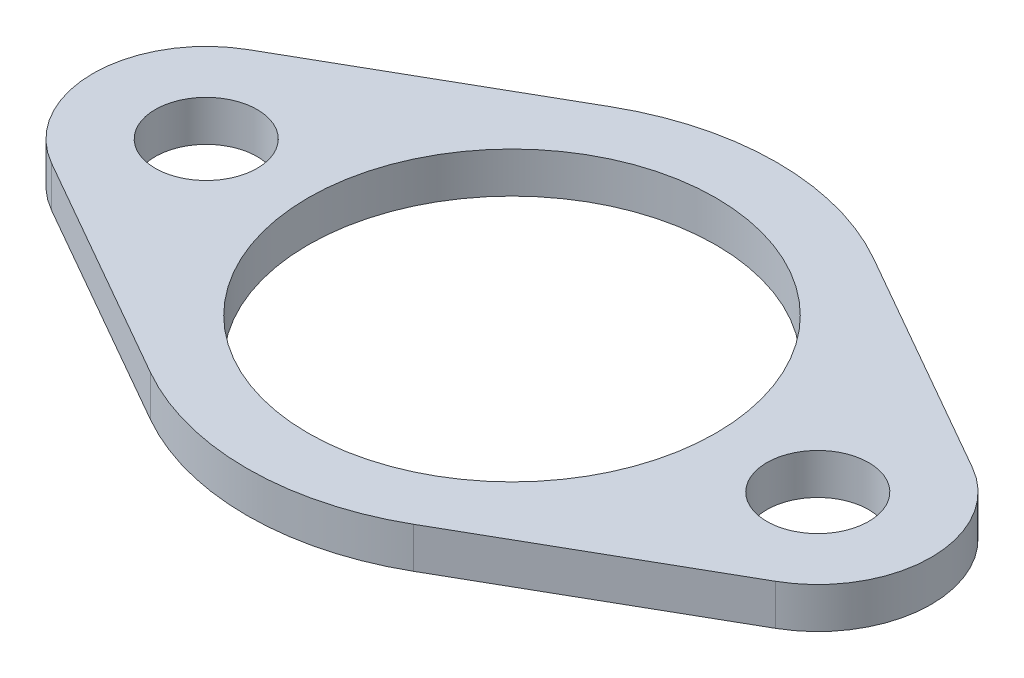
ISO-10303-21;
HEADER;
FILE_DESCRIPTION(('STEP AP214'),'2;1');
FILE_NAME('part.step','',(''),(''),'','','');
FILE_SCHEMA(('AUTOMOTIVE_DESIGN { 1 0 10303 214 1 1 1 1 }'));
ENDSEC;
DATA;
#1=APPLICATION_CONTEXT('core data for automotive mechanical design processes');
#2=APPLICATION_PROTOCOL_DEFINITION('international standard','automotive_design',2000,#1);
#3=PRODUCT_CONTEXT('',#1,'mechanical');
#4=PRODUCT('Part','Part','',(#3));
#5=PRODUCT_RELATED_PRODUCT_CATEGORY('part','',(#4));
#6=PRODUCT_DEFINITION_FORMATION('','',#4);
#7=PRODUCT_DEFINITION_CONTEXT('part definition',#1,'design');
#8=PRODUCT_DEFINITION('design','',#6,#7);
#9=PRODUCT_DEFINITION_SHAPE('','',#8);
#10=(LENGTH_UNIT() NAMED_UNIT(*) SI_UNIT(.MILLI.,.METRE.));
#11=(NAMED_UNIT(*) PLANE_ANGLE_UNIT() SI_UNIT($,.RADIAN.));
#12=(NAMED_UNIT(*) SI_UNIT($,.STERADIAN.) SOLID_ANGLE_UNIT());
#13=UNCERTAINTY_MEASURE_WITH_UNIT(LENGTH_MEASURE(1.E-05),#10,'distance_accuracy_value','');
#14=(GEOMETRIC_REPRESENTATION_CONTEXT(3) GLOBAL_UNCERTAINTY_ASSIGNED_CONTEXT((#13)) GLOBAL_UNIT_ASSIGNED_CONTEXT((#10,
#11,#12)) REPRESENTATION_CONTEXT('',''));
#15=CARTESIAN_POINT('',(0.,0.,0.));
#16=DIRECTION('',(0.,0.,1.));
#17=DIRECTION('',(1.,0.,0.));
#18=AXIS2_PLACEMENT_3D('',#15,#16,#17);
#19=CARTESIAN_POINT('',(-7.5,1.,0.));
#20=DIRECTION('',(0.,1.,0.));
#21=DIRECTION('',(0.,0.,1.));
#22=AXIS2_PLACEMENT_3D('',#19,#20,#21);
#23=PLANE('',#22);
#24=CARTESIAN_POINT('',(-7.5,1.,0.));
#25=DIRECTION('',(0.,1.,0.));
#26=DIRECTION('',(0.,0.,1.));
#27=AXIS2_PLACEMENT_3D('',#24,#25,#26);
#28=CIRCLE('',#27,1.25);
#29=CARTESIAN_POINT('',(-7.5,1.,1.25));
#30=VERTEX_POINT('',#29);
#31=EDGE_CURVE('E217',#30,#30,#28,.T.);
#32=ORIENTED_EDGE('',*,*,#31,.F.);
#33=EDGE_LOOP('',(#32));
#34=FACE_BOUND('',#33,.T.);
#35=CARTESIAN_POINT('',(-7.5,1.,0.));
#36=DIRECTION('',(0.,1.,0.));
#37=DIRECTION('',(0.,0.,1.));
#38=AXIS2_PLACEMENT_3D('',#35,#36,#37);
#39=CIRCLE('',#38,2.78);
#40=CARTESIAN_POINT('',(-8.87888,1.,-2.41393660761835));
#41=VERTEX_POINT('',#40);
#42=CARTESIAN_POINT('',(-8.87888,1.,2.41393660761835));
#43=VERTEX_POINT('',#42);
#44=EDGE_CURVE('E168',#41,#43,#39,.T.);
#45=ORIENTED_EDGE('',*,*,#44,.T.);
#46=DIRECTION('',(0.868322520726026,0.,0.496));
#47=VECTOR('',#46,1.);
#48=CARTESIAN_POINT('',(-8.87888,1.,2.41393660761835));
#49=LINE('',#48,#47);
#50=CARTESIAN_POINT('',(-3.224,1.,5.64409638471917));
#51=VERTEX_POINT('',#50);
#52=EDGE_CURVE('E104',#43,#51,#49,.T.);
#53=ORIENTED_EDGE('',*,*,#52,.T.);
#54=CARTESIAN_POINT('',(0.,1.,0.));
#55=DIRECTION('',(0.,1.,0.));
#56=DIRECTION('',(0.,0.,1.));
#57=AXIS2_PLACEMENT_3D('',#54,#55,#56);
#58=CIRCLE('',#57,6.5);
#59=CARTESIAN_POINT('',(3.224,1.,5.64409638471917));
#60=VERTEX_POINT('',#59);
#61=EDGE_CURVE('E189',#51,#60,#58,.T.);
#62=ORIENTED_EDGE('',*,*,#61,.T.);
#63=DIRECTION('',(0.868322520726026,0.,-0.496));
#64=VECTOR('',#63,1.);
#65=CARTESIAN_POINT('',(3.224,1.,5.64409638471917));
#66=LINE('',#65,#64);
#67=CARTESIAN_POINT('',(8.87888,1.,2.41393660761835));
#68=VERTEX_POINT('',#67);
#69=EDGE_CURVE('E203',#60,#68,#66,.T.);
#70=ORIENTED_EDGE('',*,*,#69,.T.);
#71=CARTESIAN_POINT('',(7.5,1.,0.));
#72=DIRECTION('',(0.,1.,0.));
#73=DIRECTION('',(0.,0.,-1.));
#74=AXIS2_PLACEMENT_3D('',#71,#72,#73);
#75=CIRCLE('',#74,2.78);
#76=CARTESIAN_POINT('',(8.87888,1.,-2.41393660761835));
#77=VERTEX_POINT('',#76);
#78=EDGE_CURVE('E123',#68,#77,#75,.T.);
#79=ORIENTED_EDGE('',*,*,#78,.T.);
#80=DIRECTION('',(-0.868322520726026,0.,-0.496));
#81=VECTOR('',#80,1.);
#82=CARTESIAN_POINT('',(3.224,1.,-5.64409638471917));
#83=LINE('',#82,#81);
#84=CARTESIAN_POINT('',(3.224,1.,-5.64409638471917));
#85=VERTEX_POINT('',#84);
#86=EDGE_CURVE('E117',#77,#85,#83,.T.);
#87=ORIENTED_EDGE('',*,*,#86,.T.);
#88=CARTESIAN_POINT('',(0.,1.,0.));
#89=DIRECTION('',(0.,1.,0.));
#90=DIRECTION('',(0.,0.,1.));
#91=AXIS2_PLACEMENT_3D('',#88,#89,#90);
#92=CIRCLE('',#91,6.5);
#93=CARTESIAN_POINT('',(-3.224,1.,-5.64409638471917));
#94=VERTEX_POINT('',#93);
#95=EDGE_CURVE('E121',#85,#94,#92,.T.);
#96=ORIENTED_EDGE('',*,*,#95,.T.);
#97=DIRECTION('',(-0.868322520726026,0.,0.496));
#98=VECTOR('',#97,1.);
#99=CARTESIAN_POINT('',(-8.87888,1.,-2.41393660761835));
#100=LINE('',#99,#98);
#101=EDGE_CURVE('E61',#94,#41,#100,.T.);
#102=ORIENTED_EDGE('',*,*,#101,.T.);
#103=EDGE_LOOP('',(#45,#53,#62,#70,#79,#87,#96,#102));
#104=FACE_BOUND('',#103,.T.);
#105=CARTESIAN_POINT('',(0.,1.,0.));
#106=DIRECTION('',(0.,1.,0.));
#107=DIRECTION('',(0.,0.,1.));
#108=AXIS2_PLACEMENT_3D('',#105,#106,#107);
#109=CIRCLE('',#108,5.);
#110=CARTESIAN_POINT('',(0.,1.,5.));
#111=VERTEX_POINT('',#110);
#112=EDGE_CURVE('E150',#111,#111,#109,.T.);
#113=ORIENTED_EDGE('',*,*,#112,.F.);
#114=EDGE_LOOP('',(#113));
#115=FACE_BOUND('',#114,.T.);
#116=CARTESIAN_POINT('',(7.5,1.,0.));
#117=DIRECTION('',(0.,1.,0.));
#118=DIRECTION('',(0.,0.,-1.));
#119=AXIS2_PLACEMENT_3D('',#116,#117,#118);
#120=CIRCLE('',#119,1.25);
#121=CARTESIAN_POINT('',(7.5,1.,-1.25));
#122=VERTEX_POINT('',#121);
#123=EDGE_CURVE('E225',#122,#122,#120,.T.);
#124=ORIENTED_EDGE('',*,*,#123,.F.);
#125=EDGE_LOOP('',(#124));
#126=FACE_BOUND('',#125,.T.);
#127=ADVANCED_FACE('F43',(#34,#104,#115,#126),#23,.T.);
#128=CARTESIAN_POINT('',(-7.5,0.,0.));
#129=DIRECTION('',(0.,1.,0.));
#130=DIRECTION('',(0.,0.,1.));
#131=AXIS2_PLACEMENT_3D('',#128,#129,#130);
#132=PLANE('',#131);
#133=CARTESIAN_POINT('',(-7.5,0.,0.));
#134=DIRECTION('',(0.,1.,0.));
#135=DIRECTION('',(0.,0.,1.));
#136=AXIS2_PLACEMENT_3D('',#133,#134,#135);
#137=CIRCLE('',#136,2.78);
#138=CARTESIAN_POINT('',(-8.87888,0.,-2.41393660761835));
#139=VERTEX_POINT('',#138);
#140=CARTESIAN_POINT('',(-8.87888,0.,2.41393660761835));
#141=VERTEX_POINT('',#140);
#142=EDGE_CURVE('E145',#139,#141,#137,.T.);
#143=ORIENTED_EDGE('',*,*,#142,.F.);
#144=DIRECTION('',(-0.868322520726026,0.,0.496));
#145=VECTOR('',#144,1.);
#146=CARTESIAN_POINT('',(-8.87888,0.,-2.41393660761835));
#147=LINE('',#146,#145);
#148=CARTESIAN_POINT('',(-3.224,0.,-5.64409638471917));
#149=VERTEX_POINT('',#148);
#150=EDGE_CURVE('E96',#149,#139,#147,.T.);
#151=ORIENTED_EDGE('',*,*,#150,.F.);
#152=CARTESIAN_POINT('',(0.,0.,0.));
#153=DIRECTION('',(0.,1.,0.));
#154=DIRECTION('',(0.,0.,1.));
#155=AXIS2_PLACEMENT_3D('',#152,#153,#154);
#156=CIRCLE('',#155,6.5);
#157=CARTESIAN_POINT('',(3.224,0.,-5.64409638471917));
#158=VERTEX_POINT('',#157);
#159=EDGE_CURVE('E90',#158,#149,#156,.T.);
#160=ORIENTED_EDGE('',*,*,#159,.F.);
#161=DIRECTION('',(-0.868322520726026,0.,-0.496));
#162=VECTOR('',#161,1.);
#163=CARTESIAN_POINT('',(3.224,0.,-5.64409638471917));
#164=LINE('',#163,#162);
#165=CARTESIAN_POINT('',(8.87888,0.,-2.41393660761835));
#166=VERTEX_POINT('',#165);
#167=EDGE_CURVE('E132',#166,#158,#164,.T.);
#168=ORIENTED_EDGE('',*,*,#167,.F.);
#169=CARTESIAN_POINT('',(7.5,0.,0.));
#170=DIRECTION('',(0.,1.,0.));
#171=DIRECTION('',(0.,0.,-1.));
#172=AXIS2_PLACEMENT_3D('',#169,#170,#171);
#173=CIRCLE('',#172,2.78);
#174=CARTESIAN_POINT('',(8.87888,0.,2.41393660761835));
#175=VERTEX_POINT('',#174);
#176=EDGE_CURVE('E159',#175,#166,#173,.T.);
#177=ORIENTED_EDGE('',*,*,#176,.F.);
#178=DIRECTION('',(0.868322520726026,0.,-0.496));
#179=VECTOR('',#178,1.);
#180=CARTESIAN_POINT('',(3.224,0.,5.64409638471917));
#181=LINE('',#180,#179);
#182=CARTESIAN_POINT('',(3.224,0.,5.64409638471917));
#183=VERTEX_POINT('',#182);
#184=EDGE_CURVE('E156',#183,#175,#181,.T.);
#185=ORIENTED_EDGE('',*,*,#184,.F.);
#186=CARTESIAN_POINT('',(0.,0.,0.));
#187=DIRECTION('',(0.,1.,0.));
#188=DIRECTION('',(0.,0.,1.));
#189=AXIS2_PLACEMENT_3D('',#186,#187,#188);
#190=CIRCLE('',#189,6.5);
#191=CARTESIAN_POINT('',(-3.224,0.,5.64409638471917));
#192=VERTEX_POINT('',#191);
#193=EDGE_CURVE('E153',#192,#183,#190,.T.);
#194=ORIENTED_EDGE('',*,*,#193,.F.);
#195=DIRECTION('',(0.868322520726026,0.,0.496));
#196=VECTOR('',#195,1.);
#197=CARTESIAN_POINT('',(-8.87888,0.,2.41393660761835));
#198=LINE('',#197,#196);
#199=EDGE_CURVE('E149',#141,#192,#198,.T.);
#200=ORIENTED_EDGE('',*,*,#199,.F.);
#201=EDGE_LOOP('',(#143,#151,#160,#168,#177,#185,#194,#200));
#202=FACE_BOUND('',#201,.T.);
#203=CARTESIAN_POINT('',(0.,0.,0.));
#204=DIRECTION('',(0.,1.,0.));
#205=DIRECTION('',(0.,0.,1.));
#206=AXIS2_PLACEMENT_3D('',#203,#204,#205);
#207=CIRCLE('',#206,5.);
#208=CARTESIAN_POINT('',(0.,0.,5.));
#209=VERTEX_POINT('',#208);
#210=EDGE_CURVE('E213',#209,#209,#207,.T.);
#211=ORIENTED_EDGE('',*,*,#210,.T.);
#212=EDGE_LOOP('',(#211));
#213=FACE_BOUND('',#212,.T.);
#214=CARTESIAN_POINT('',(-7.5,0.,0.));
#215=DIRECTION('',(0.,1.,0.));
#216=DIRECTION('',(0.,0.,1.));
#217=AXIS2_PLACEMENT_3D('',#214,#215,#216);
#218=CIRCLE('',#217,1.25);
#219=CARTESIAN_POINT('',(-7.5,0.,1.25));
#220=VERTEX_POINT('',#219);
#221=EDGE_CURVE('E221',#220,#220,#218,.T.);
#222=ORIENTED_EDGE('',*,*,#221,.T.);
#223=EDGE_LOOP('',(#222));
#224=FACE_BOUND('',#223,.T.);
#225=CARTESIAN_POINT('',(7.5,0.,0.));
#226=DIRECTION('',(0.,1.,0.));
#227=DIRECTION('',(0.,0.,-1.));
#228=AXIS2_PLACEMENT_3D('',#225,#226,#227);
#229=CIRCLE('',#228,1.25);
#230=CARTESIAN_POINT('',(7.5,0.,-1.25));
#231=VERTEX_POINT('',#230);
#232=EDGE_CURVE('E229',#231,#231,#229,.T.);
#233=ORIENTED_EDGE('',*,*,#232,.T.);
#234=EDGE_LOOP('',(#233));
#235=FACE_BOUND('',#234,.T.);
#236=ADVANCED_FACE('F193',(#202,#213,#224,#235),#132,.F.);
#237=CARTESIAN_POINT('',(-7.5,1.,0.));
#238=DIRECTION('',(0.,-1.,0.));
#239=DIRECTION('',(0.,0.,-1.));
#240=AXIS2_PLACEMENT_3D('',#237,#238,#239);
#241=CYLINDRICAL_SURFACE('',#240,2.78);
#242=ORIENTED_EDGE('',*,*,#142,.T.);
#243=DIRECTION('',(0.,-1.,0.));
#244=VECTOR('',#243,1.);
#245=CARTESIAN_POINT('',(-8.87888,1.,2.41393660761835));
#246=LINE('',#245,#244);
#247=EDGE_CURVE('E11',#43,#141,#246,.T.);
#248=ORIENTED_EDGE('',*,*,#247,.F.);
#249=ORIENTED_EDGE('',*,*,#44,.F.);
#250=DIRECTION('',(0.,-1.,0.));
#251=VECTOR('',#250,1.);
#252=CARTESIAN_POINT('',(-8.87888,1.,-2.41393660761835));
#253=LINE('',#252,#251);
#254=EDGE_CURVE('E141',#41,#139,#253,.T.);
#255=ORIENTED_EDGE('',*,*,#254,.T.);
#256=EDGE_LOOP('',(#242,#248,#249,#255));
#257=FACE_BOUND('',#256,.T.);
#258=ADVANCED_FACE('F45',(#257),#241,.T.);
#259=CARTESIAN_POINT('',(-8.87888,1.,2.41393660761835));
#260=DIRECTION('',(0.496,0.,-0.868322520726026));
#261=DIRECTION('',(-0.868322520726026,0.,-0.496));
#262=AXIS2_PLACEMENT_3D('',#259,#260,#261);
#263=PLANE('',#262);
#264=ORIENTED_EDGE('',*,*,#199,.T.);
#265=DIRECTION('',(0.,-1.,0.));
#266=VECTOR('',#265,1.);
#267=CARTESIAN_POINT('',(-3.224,1.,5.64409638471917));
#268=LINE('',#267,#266);
#269=EDGE_CURVE('E53',#51,#192,#268,.T.);
#270=ORIENTED_EDGE('',*,*,#269,.F.);
#271=ORIENTED_EDGE('',*,*,#52,.F.);
#272=ORIENTED_EDGE('',*,*,#247,.T.);
#273=EDGE_LOOP('',(#264,#270,#271,#272));
#274=FACE_BOUND('',#273,.T.);
#275=ADVANCED_FACE('F264',(#274),#263,.F.);
#276=CARTESIAN_POINT('',(0.,1.,0.));
#277=DIRECTION('',(0.,-1.,0.));
#278=DIRECTION('',(0.,0.,-1.));
#279=AXIS2_PLACEMENT_3D('',#276,#277,#278);
#280=CYLINDRICAL_SURFACE('',#279,6.5);
#281=ORIENTED_EDGE('',*,*,#193,.T.);
#282=DIRECTION('',(0.,-1.,0.));
#283=VECTOR('',#282,1.);
#284=CARTESIAN_POINT('',(3.224,1.,5.64409638471917));
#285=LINE('',#284,#283);
#286=EDGE_CURVE('E179',#60,#183,#285,.T.);
#287=ORIENTED_EDGE('',*,*,#286,.F.);
#288=ORIENTED_EDGE('',*,*,#61,.F.);
#289=ORIENTED_EDGE('',*,*,#269,.T.);
#290=EDGE_LOOP('',(#281,#287,#288,#289));
#291=FACE_BOUND('',#290,.T.);
#292=ADVANCED_FACE('F187',(#291),#280,.T.);
#293=CARTESIAN_POINT('',(3.224,1.,5.64409638471917));
#294=DIRECTION('',(-0.496,0.,-0.868322520726026));
#295=DIRECTION('',(-0.868322520726026,0.,0.496));
#296=AXIS2_PLACEMENT_3D('',#293,#294,#295);
#297=PLANE('',#296);
#298=ORIENTED_EDGE('',*,*,#184,.T.);
#299=DIRECTION('',(0.,-1.,0.));
#300=VECTOR('',#299,1.);
#301=CARTESIAN_POINT('',(8.87888,1.,2.41393660761835));
#302=LINE('',#301,#300);
#303=EDGE_CURVE('E175',#68,#175,#302,.T.);
#304=ORIENTED_EDGE('',*,*,#303,.F.);
#305=ORIENTED_EDGE('',*,*,#69,.F.);
#306=ORIENTED_EDGE('',*,*,#286,.T.);
#307=EDGE_LOOP('',(#298,#304,#305,#306));
#308=FACE_BOUND('',#307,.T.);
#309=ADVANCED_FACE('F198',(#308),#297,.F.);
#310=CARTESIAN_POINT('',(7.5,1.,0.));
#311=DIRECTION('',(0.,-1.,0.));
#312=DIRECTION('',(0.,0.,-1.));
#313=AXIS2_PLACEMENT_3D('',#310,#311,#312);
#314=CYLINDRICAL_SURFACE('',#313,2.78);
#315=ORIENTED_EDGE('',*,*,#176,.T.);
#316=DIRECTION('',(0.,-1.,0.));
#317=VECTOR('',#316,1.);
#318=CARTESIAN_POINT('',(8.87888,1.,-2.41393660761835));
#319=LINE('',#318,#317);
#320=EDGE_CURVE('E134',#77,#166,#319,.T.);
#321=ORIENTED_EDGE('',*,*,#320,.F.);
#322=ORIENTED_EDGE('',*,*,#78,.F.);
#323=ORIENTED_EDGE('',*,*,#303,.T.);
#324=EDGE_LOOP('',(#315,#321,#322,#323));
#325=FACE_BOUND('',#324,.T.);
#326=ADVANCED_FACE('F201',(#325),#314,.T.);
#327=CARTESIAN_POINT('',(3.224,1.,-5.64409638471917));
#328=DIRECTION('',(-0.496,0.,0.868322520726026));
#329=DIRECTION('',(0.868322520726026,0.,0.496));
#330=AXIS2_PLACEMENT_3D('',#327,#328,#329);
#331=PLANE('',#330);
#332=ORIENTED_EDGE('',*,*,#167,.T.);
#333=DIRECTION('',(0.,-1.,0.));
#334=VECTOR('',#333,1.);
#335=CARTESIAN_POINT('',(3.224,1.,-5.64409638471917));
#336=LINE('',#335,#334);
#337=EDGE_CURVE('E129',#85,#158,#336,.T.);
#338=ORIENTED_EDGE('',*,*,#337,.F.);
#339=ORIENTED_EDGE('',*,*,#86,.F.);
#340=ORIENTED_EDGE('',*,*,#320,.T.);
#341=EDGE_LOOP('',(#332,#338,#339,#340));
#342=FACE_BOUND('',#341,.T.);
#343=ADVANCED_FACE('F130',(#342),#331,.F.);
#344=CARTESIAN_POINT('',(0.,1.,0.));
#345=DIRECTION('',(0.,-1.,0.));
#346=DIRECTION('',(0.,0.,-1.));
#347=AXIS2_PLACEMENT_3D('',#344,#345,#346);
#348=CYLINDRICAL_SURFACE('',#347,6.5);
#349=ORIENTED_EDGE('',*,*,#159,.T.);
#350=DIRECTION('',(0.,-1.,0.));
#351=VECTOR('',#350,1.);
#352=CARTESIAN_POINT('',(-3.224,1.,-5.64409638471917));
#353=LINE('',#352,#351);
#354=EDGE_CURVE('E135',#94,#149,#353,.T.);
#355=ORIENTED_EDGE('',*,*,#354,.F.);
#356=ORIENTED_EDGE('',*,*,#95,.F.);
#357=ORIENTED_EDGE('',*,*,#337,.T.);
#358=EDGE_LOOP('',(#349,#355,#356,#357));
#359=FACE_BOUND('',#358,.T.);
#360=ADVANCED_FACE('F137',(#359),#348,.T.);
#361=CARTESIAN_POINT('',(-8.87888,1.,-2.41393660761835));
#362=DIRECTION('',(0.496,0.,0.868322520726026));
#363=DIRECTION('',(0.868322520726026,0.,-0.496));
#364=AXIS2_PLACEMENT_3D('',#361,#362,#363);
#365=PLANE('',#364);
#366=ORIENTED_EDGE('',*,*,#150,.T.);
#367=ORIENTED_EDGE('',*,*,#254,.F.);
#368=ORIENTED_EDGE('',*,*,#101,.F.);
#369=ORIENTED_EDGE('',*,*,#354,.T.);
#370=EDGE_LOOP('',(#366,#367,#368,#369));
#371=FACE_BOUND('',#370,.T.);
#372=ADVANCED_FACE('F252',(#371),#365,.F.);
#373=CARTESIAN_POINT('',(0.,1.,0.));
#374=DIRECTION('',(0.,-1.,0.));
#375=DIRECTION('',(0.,0.,-1.));
#376=AXIS2_PLACEMENT_3D('',#373,#374,#375);
#377=CYLINDRICAL_SURFACE('',#376,5.);
#378=ORIENTED_EDGE('',*,*,#112,.T.);
#379=EDGE_LOOP('',(#378));
#380=FACE_BOUND('',#379,.T.);
#381=ORIENTED_EDGE('',*,*,#210,.F.);
#382=EDGE_LOOP('',(#381));
#383=FACE_BOUND('',#382,.T.);
#384=ADVANCED_FACE('F249',(#380,#383),#377,.F.);
#385=CARTESIAN_POINT('',(-7.5,1.,0.));
#386=DIRECTION('',(0.,-1.,0.));
#387=DIRECTION('',(0.,0.,-1.));
#388=AXIS2_PLACEMENT_3D('',#385,#386,#387);
#389=CYLINDRICAL_SURFACE('',#388,1.25);
#390=ORIENTED_EDGE('',*,*,#31,.T.);
#391=EDGE_LOOP('',(#390));
#392=FACE_BOUND('',#391,.T.);
#393=ORIENTED_EDGE('',*,*,#221,.F.);
#394=EDGE_LOOP('',(#393));
#395=FACE_BOUND('',#394,.T.);
#396=ADVANCED_FACE('F340',(#392,#395),#389,.F.);
#397=CARTESIAN_POINT('',(7.5,1.,0.));
#398=DIRECTION('',(0.,-1.,0.));
#399=DIRECTION('',(0.,0.,-1.));
#400=AXIS2_PLACEMENT_3D('',#397,#398,#399);
#401=CYLINDRICAL_SURFACE('',#400,1.25);
#402=ORIENTED_EDGE('',*,*,#123,.T.);
#403=EDGE_LOOP('',(#402));
#404=FACE_BOUND('',#403,.T.);
#405=ORIENTED_EDGE('',*,*,#232,.F.);
#406=EDGE_LOOP('',(#405));
#407=FACE_BOUND('',#406,.T.);
#408=ADVANCED_FACE('F237',(#404,#407),#401,.F.);
#409=CLOSED_SHELL('',(#127,#236,#258,#275,#292,#309,#326,#343,#360,#372,#384,#396,#408));
#410=MANIFOLD_SOLID_BREP('B2',#409);
#411=ADVANCED_BREP_SHAPE_REPRESENTATION('',(#18,#410),#14);
#412=SHAPE_DEFINITION_REPRESENTATION(#9,#411);
ENDSEC;
END-ISO-10303-21;
